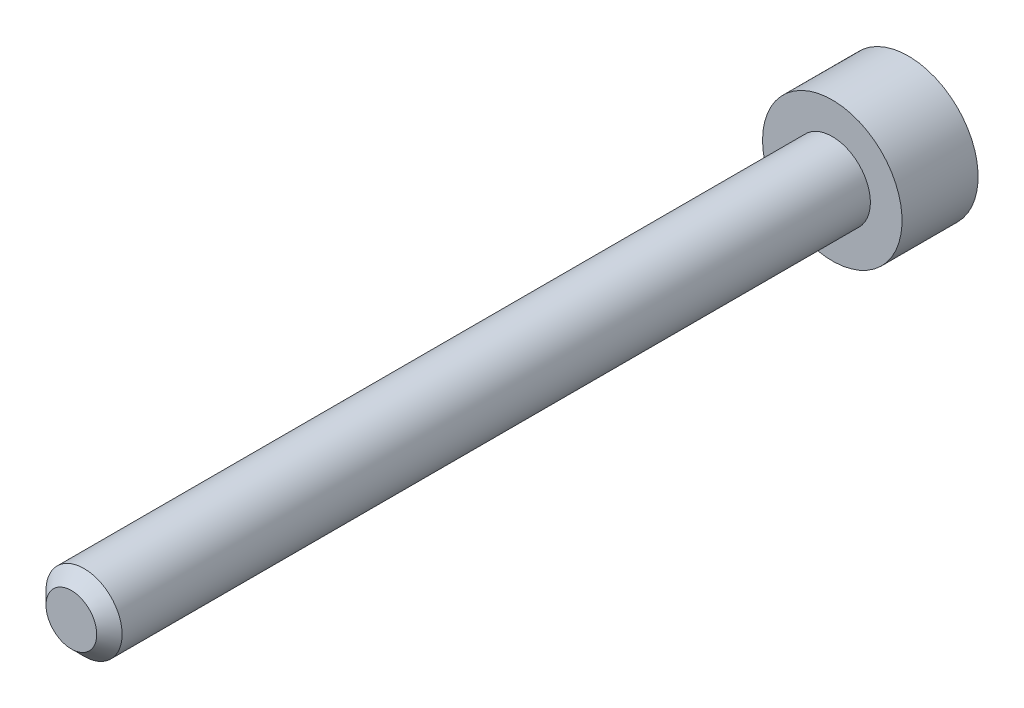
ISO-10303-21;
HEADER;
FILE_DESCRIPTION(('STEP AP214'),'2;1');
FILE_NAME('part.step','',(''),(''),'','','');
FILE_SCHEMA(('AUTOMOTIVE_DESIGN { 1 0 10303 214 1 1 1 1 }'));
ENDSEC;
DATA;
#1=APPLICATION_CONTEXT('core data for automotive mechanical design processes');
#2=APPLICATION_PROTOCOL_DEFINITION('international standard','automotive_design',2000,#1);
#3=PRODUCT_CONTEXT('',#1,'mechanical');
#4=PRODUCT('Part','Part','',(#3));
#5=PRODUCT_RELATED_PRODUCT_CATEGORY('part','',(#4));
#6=PRODUCT_DEFINITION_FORMATION('','',#4);
#7=PRODUCT_DEFINITION_CONTEXT('part definition',#1,'design');
#8=PRODUCT_DEFINITION('design','',#6,#7);
#9=PRODUCT_DEFINITION_SHAPE('','',#8);
#10=(LENGTH_UNIT() NAMED_UNIT(*) SI_UNIT(.MILLI.,.METRE.));
#11=(NAMED_UNIT(*) PLANE_ANGLE_UNIT() SI_UNIT($,.RADIAN.));
#12=(NAMED_UNIT(*) SI_UNIT($,.STERADIAN.) SOLID_ANGLE_UNIT());
#13=UNCERTAINTY_MEASURE_WITH_UNIT(LENGTH_MEASURE(1.E-05),#10,'distance_accuracy_value','');
#14=(GEOMETRIC_REPRESENTATION_CONTEXT(3) GLOBAL_UNCERTAINTY_ASSIGNED_CONTEXT((#13)) GLOBAL_UNIT_ASSIGNED_CONTEXT((#10,
#11,#12)) REPRESENTATION_CONTEXT('',''));
#15=CARTESIAN_POINT('',(0.,0.,0.));
#16=DIRECTION('',(0.,0.,1.));
#17=DIRECTION('',(1.,0.,0.));
#18=AXIS2_PLACEMENT_3D('',#15,#16,#17);
#19=CARTESIAN_POINT('',(0.,0.,30.));
#20=DIRECTION('',(0.,0.,-1.));
#21=DIRECTION('',(-1.,0.,0.));
#22=AXIS2_PLACEMENT_3D('',#19,#20,#21);
#23=CYLINDRICAL_SURFACE('',#22,1.5);
#24=CARTESIAN_POINT('',(0.,0.,29.5));
#25=DIRECTION('',(0.,0.,1.));
#26=DIRECTION('',(1.,0.,0.));
#27=AXIS2_PLACEMENT_3D('',#24,#25,#26);
#28=CIRCLE('',#27,1.5);
#29=CARTESIAN_POINT('',(1.5,0.,29.5));
#30=VERTEX_POINT('',#29);
#31=EDGE_CURVE('E10',#30,#30,#28,.F.);
#32=ORIENTED_EDGE('',*,*,#31,.T.);
#33=EDGE_LOOP('',(#32));
#34=FACE_BOUND('',#33,.T.);
#35=CARTESIAN_POINT('',(0.,0.,0.));
#36=DIRECTION('',(0.,0.,-1.));
#37=DIRECTION('',(-1.,0.,0.));
#38=AXIS2_PLACEMENT_3D('',#35,#36,#37);
#39=CIRCLE('',#38,1.5);
#40=CARTESIAN_POINT('',(-1.5,0.,0.));
#41=VERTEX_POINT('',#40);
#42=EDGE_CURVE('E39',#41,#41,#39,.T.);
#43=ORIENTED_EDGE('',*,*,#42,.F.);
#44=EDGE_LOOP('',(#43));
#45=FACE_BOUND('',#44,.T.);
#46=ADVANCED_FACE('F28',(#34,#45),#23,.T.);
#47=CARTESIAN_POINT('',(0.,0.,30.));
#48=DIRECTION('',(0.,0.,1.));
#49=DIRECTION('',(1.,0.,0.));
#50=AXIS2_PLACEMENT_3D('',#47,#48,#49);
#51=PLANE('',#50);
#52=CARTESIAN_POINT('',(0.,0.,30.));
#53=DIRECTION('',(0.,0.,1.));
#54=DIRECTION('',(1.,0.,0.));
#55=AXIS2_PLACEMENT_3D('',#52,#53,#54);
#56=CIRCLE('',#55,1.);
#57=CARTESIAN_POINT('',(1.,0.,30.));
#58=VERTEX_POINT('',#57);
#59=EDGE_CURVE('E35',#58,#58,#56,.T.);
#60=ORIENTED_EDGE('',*,*,#59,.T.);
#61=EDGE_LOOP('',(#60));
#62=FACE_BOUND('',#61,.T.);
#63=ADVANCED_FACE('F63',(#62),#51,.T.);
#64=CARTESIAN_POINT('',(0.,0.,0.));
#65=DIRECTION('',(0.,0.,-1.));
#66=DIRECTION('',(-1.,0.,0.));
#67=AXIS2_PLACEMENT_3D('',#64,#65,#66);
#68=PLANE('',#67);
#69=CARTESIAN_POINT('',(0.,0.,0.));
#70=DIRECTION('',(0.,0.,-1.));
#71=DIRECTION('',(-1.,0.,0.));
#72=AXIS2_PLACEMENT_3D('',#69,#70,#71);
#73=CIRCLE('',#72,2.75);
#74=CARTESIAN_POINT('',(-2.75,0.,0.));
#75=VERTEX_POINT('',#74);
#76=EDGE_CURVE('E46',#75,#75,#73,.T.);
#77=ORIENTED_EDGE('',*,*,#76,.F.);
#78=EDGE_LOOP('',(#77));
#79=FACE_BOUND('',#78,.T.);
#80=ORIENTED_EDGE('',*,*,#42,.T.);
#81=EDGE_LOOP('',(#80));
#82=FACE_BOUND('',#81,.T.);
#83=ADVANCED_FACE('F57',(#79,#82),#68,.F.);
#84=CARTESIAN_POINT('',(0.,0.,-3.));
#85=DIRECTION('',(0.,0.,1.));
#86=DIRECTION('',(1.,0.,0.));
#87=AXIS2_PLACEMENT_3D('',#84,#85,#86);
#88=CYLINDRICAL_SURFACE('',#87,2.75);
#89=CARTESIAN_POINT('',(0.,0.,-3.));
#90=DIRECTION('',(0.,0.,-1.));
#91=DIRECTION('',(-1.,0.,0.));
#92=AXIS2_PLACEMENT_3D('',#89,#90,#91);
#93=CIRCLE('',#92,2.75);
#94=CARTESIAN_POINT('',(-2.75,0.,-3.));
#95=VERTEX_POINT('',#94);
#96=EDGE_CURVE('E43',#95,#95,#93,.T.);
#97=ORIENTED_EDGE('',*,*,#96,.F.);
#98=EDGE_LOOP('',(#97));
#99=FACE_BOUND('',#98,.T.);
#100=ORIENTED_EDGE('',*,*,#76,.T.);
#101=EDGE_LOOP('',(#100));
#102=FACE_BOUND('',#101,.T.);
#103=ADVANCED_FACE('F54',(#99,#102),#88,.T.);
#104=CARTESIAN_POINT('',(0.,0.,-3.));
#105=DIRECTION('',(0.,0.,-1.));
#106=DIRECTION('',(-1.,0.,0.));
#107=AXIS2_PLACEMENT_3D('',#104,#105,#106);
#108=PLANE('',#107);
#109=ORIENTED_EDGE('',*,*,#96,.T.);
#110=EDGE_LOOP('',(#109));
#111=FACE_BOUND('',#110,.T.);
#112=ADVANCED_FACE('F52',(#111),#108,.T.);
#113=CARTESIAN_POINT('',(0.,0.,30.));
#114=DIRECTION('',(0.,0.,-1.));
#115=DIRECTION('',(-1.,0.,0.));
#116=AXIS2_PLACEMENT_3D('',#113,#114,#115);
#117=CONICAL_SURFACE('',#116,1.,0.785398163397445);
#118=ORIENTED_EDGE('',*,*,#31,.F.);
#119=EDGE_LOOP('',(#118));
#120=FACE_BOUND('',#119,.T.);
#121=ORIENTED_EDGE('',*,*,#59,.F.);
#122=EDGE_LOOP('',(#121));
#123=FACE_BOUND('',#122,.T.);
#124=ADVANCED_FACE('F30',(#120,#123),#117,.T.);
#125=CLOSED_SHELL('',(#46,#63,#83,#103,#112,#124));
#126=MANIFOLD_SOLID_BREP('B2',#125);
#127=ADVANCED_BREP_SHAPE_REPRESENTATION('',(#18,#126),#14);
#128=SHAPE_DEFINITION_REPRESENTATION(#9,#127);
ENDSEC;
END-ISO-10303-21;
